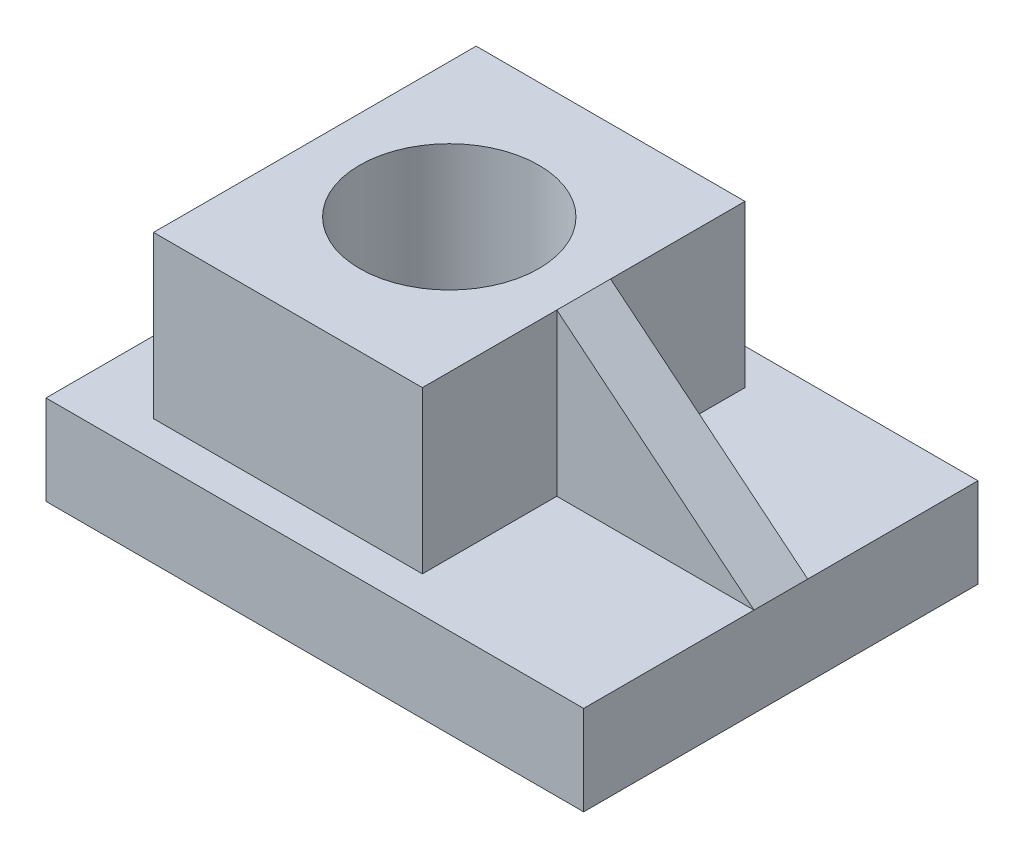
ISO-10303-21;
HEADER;
FILE_DESCRIPTION(('STEP AP214'),'2;1');
FILE_NAME('part.step','',(''),(''),'','','');
FILE_SCHEMA(('AUTOMOTIVE_DESIGN { 1 0 10303 214 1 1 1 1 }'));
ENDSEC;
DATA;
#1=APPLICATION_CONTEXT('core data for automotive mechanical design processes');
#2=APPLICATION_PROTOCOL_DEFINITION('international standard','automotive_design',2000,#1);
#3=PRODUCT_CONTEXT('',#1,'mechanical');
#4=PRODUCT('Part','Part','',(#3));
#5=PRODUCT_RELATED_PRODUCT_CATEGORY('part','',(#4));
#6=PRODUCT_DEFINITION_FORMATION('','',#4);
#7=PRODUCT_DEFINITION_CONTEXT('part definition',#1,'design');
#8=PRODUCT_DEFINITION('design','',#6,#7);
#9=PRODUCT_DEFINITION_SHAPE('','',#8);
#10=(LENGTH_UNIT() NAMED_UNIT(*) SI_UNIT(.MILLI.,.METRE.));
#11=(NAMED_UNIT(*) PLANE_ANGLE_UNIT() SI_UNIT($,.RADIAN.));
#12=(NAMED_UNIT(*) SI_UNIT($,.STERADIAN.) SOLID_ANGLE_UNIT());
#13=UNCERTAINTY_MEASURE_WITH_UNIT(LENGTH_MEASURE(1.E-05),#10,'distance_accuracy_value','');
#14=(GEOMETRIC_REPRESENTATION_CONTEXT(3) GLOBAL_UNCERTAINTY_ASSIGNED_CONTEXT((#13)) GLOBAL_UNIT_ASSIGNED_CONTEXT((#10,
#11,#12)) REPRESENTATION_CONTEXT('',''));
#15=CARTESIAN_POINT('',(0.,0.,0.));
#16=DIRECTION('',(0.,0.,1.));
#17=DIRECTION('',(1.,0.,0.));
#18=AXIS2_PLACEMENT_3D('',#15,#16,#17);
#19=CARTESIAN_POINT('',(8.00000000000014,28.,18.));
#20=DIRECTION('',(-1.,0.,0.));
#21=DIRECTION('',(0.,0.,1.));
#22=AXIS2_PLACEMENT_3D('',#19,#20,#21);
#23=PLANE('',#22);
#24=DIRECTION('',(0.,1.,0.));
#25=VECTOR('',#24,1.);
#26=CARTESIAN_POINT('',(8.00000000000014,28.,-3.));
#27=LINE('',#26,#25);
#28=CARTESIAN_POINT('',(8.00000000000014,10.,-3.));
#29=VERTEX_POINT('',#28);
#30=CARTESIAN_POINT('',(8.00000000000014,28.,-3.));
#31=VERTEX_POINT('',#30);
#32=EDGE_CURVE('E147',#29,#31,#27,.T.);
#33=ORIENTED_EDGE('',*,*,#32,.F.);
#34=DIRECTION('',(0.,0.,-1.));
#35=VECTOR('',#34,1.);
#36=CARTESIAN_POINT('',(8.00000000000014,10.,18.));
#37=LINE('',#36,#35);
#38=CARTESIAN_POINT('',(8.00000000000014,10.,-18.));
#39=VERTEX_POINT('',#38);
#40=EDGE_CURVE('E156',#29,#39,#37,.T.);
#41=ORIENTED_EDGE('',*,*,#40,.T.);
#42=DIRECTION('',(0.,-1.,0.));
#43=VECTOR('',#42,1.);
#44=CARTESIAN_POINT('',(8.00000000000014,28.,-18.));
#45=LINE('',#44,#43);
#46=CARTESIAN_POINT('',(8.00000000000014,28.,-18.));
#47=VERTEX_POINT('',#46);
#48=EDGE_CURVE('E172',#47,#39,#45,.T.);
#49=ORIENTED_EDGE('',*,*,#48,.F.);
#50=DIRECTION('',(0.,0.,-1.));
#51=VECTOR('',#50,1.);
#52=CARTESIAN_POINT('',(8.00000000000014,28.,18.));
#53=LINE('',#52,#51);
#54=EDGE_CURVE('E269',#31,#47,#53,.T.);
#55=ORIENTED_EDGE('',*,*,#54,.F.);
#56=EDGE_LOOP('',(#33,#41,#49,#55));
#57=FACE_BOUND('',#56,.T.);
#58=ADVANCED_FACE('F45',(#57),#23,.F.);
#59=CARTESIAN_POINT('',(0.,10.,0.));
#60=DIRECTION('',(0.,-1.,0.));
#61=DIRECTION('',(0.,0.,-1.));
#62=AXIS2_PLACEMENT_3D('',#59,#60,#61);
#63=PLANE('',#62);
#64=DIRECTION('',(0.,0.,-1.));
#65=VECTOR('',#64,1.);
#66=CARTESIAN_POINT('',(30.,10.,22.));
#67=LINE('',#66,#65);
#68=CARTESIAN_POINT('',(30.,10.,22.));
#69=VERTEX_POINT('',#68);
#70=CARTESIAN_POINT('',(30.,10.,3.));
#71=VERTEX_POINT('',#70);
#72=EDGE_CURVE('E162',#69,#71,#67,.T.);
#73=ORIENTED_EDGE('',*,*,#72,.T.);
#74=DIRECTION('',(-1.,0.,0.));
#75=VECTOR('',#74,1.);
#76=CARTESIAN_POINT('',(0.,10.,3.));
#77=LINE('',#76,#75);
#78=CARTESIAN_POINT('',(8.00000000000014,10.,3.));
#79=VERTEX_POINT('',#78);
#80=EDGE_CURVE('E140',#71,#79,#77,.T.);
#81=ORIENTED_EDGE('',*,*,#80,.T.);
#82=CARTESIAN_POINT('',(8.00000000000014,10.,18.));
#83=VERTEX_POINT('',#82);
#84=EDGE_CURVE('E69',#83,#79,#37,.T.);
#85=ORIENTED_EDGE('',*,*,#84,.F.);
#86=DIRECTION('',(1.,0.,0.));
#87=VECTOR('',#86,1.);
#88=CARTESIAN_POINT('',(-21.9999999999999,10.,18.));
#89=LINE('',#88,#87);
#90=CARTESIAN_POINT('',(-21.9999999999999,10.,18.));
#91=VERTEX_POINT('',#90);
#92=EDGE_CURVE('E266',#91,#83,#89,.T.);
#93=ORIENTED_EDGE('',*,*,#92,.F.);
#94=DIRECTION('',(0.,0.,1.));
#95=VECTOR('',#94,1.);
#96=CARTESIAN_POINT('',(-21.9999999999999,10.,18.));
#97=LINE('',#96,#95);
#98=CARTESIAN_POINT('',(-21.9999999999999,10.,-18.));
#99=VERTEX_POINT('',#98);
#100=EDGE_CURVE('E257',#99,#91,#97,.T.);
#101=ORIENTED_EDGE('',*,*,#100,.F.);
#102=DIRECTION('',(-1.,0.,0.));
#103=VECTOR('',#102,1.);
#104=CARTESIAN_POINT('',(-21.9999999999999,10.,-18.));
#105=LINE('',#104,#103);
#106=EDGE_CURVE('E252',#39,#99,#105,.T.);
#107=ORIENTED_EDGE('',*,*,#106,.F.);
#108=ORIENTED_EDGE('',*,*,#40,.F.);
#109=DIRECTION('',(-1.,0.,0.));
#110=VECTOR('',#109,1.);
#111=CARTESIAN_POINT('',(0.,10.,-3.));
#112=LINE('',#111,#110);
#113=CARTESIAN_POINT('',(30.,10.,-3.));
#114=VERTEX_POINT('',#113);
#115=EDGE_CURVE('E145',#114,#29,#112,.T.);
#116=ORIENTED_EDGE('',*,*,#115,.F.);
#117=CARTESIAN_POINT('',(30.,10.,-22.));
#118=VERTEX_POINT('',#117);
#119=EDGE_CURVE('E153',#114,#118,#67,.T.);
#120=ORIENTED_EDGE('',*,*,#119,.T.);
#121=DIRECTION('',(-1.,0.,0.));
#122=VECTOR('',#121,1.);
#123=CARTESIAN_POINT('',(-30.,10.,-22.));
#124=LINE('',#123,#122);
#125=CARTESIAN_POINT('',(-30.,10.,-22.));
#126=VERTEX_POINT('',#125);
#127=EDGE_CURVE('E167',#118,#126,#124,.T.);
#128=ORIENTED_EDGE('',*,*,#127,.T.);
#129=DIRECTION('',(0.,0.,1.));
#130=VECTOR('',#129,1.);
#131=CARTESIAN_POINT('',(-30.,10.,22.));
#132=LINE('',#131,#130);
#133=CARTESIAN_POINT('',(-30.,10.,22.));
#134=VERTEX_POINT('',#133);
#135=EDGE_CURVE('E176',#126,#134,#132,.T.);
#136=ORIENTED_EDGE('',*,*,#135,.T.);
#137=DIRECTION('',(1.,0.,0.));
#138=VECTOR('',#137,1.);
#139=CARTESIAN_POINT('',(-30.,10.,22.));
#140=LINE('',#139,#138);
#141=EDGE_CURVE('E179',#134,#69,#140,.T.);
#142=ORIENTED_EDGE('',*,*,#141,.T.);
#143=EDGE_LOOP('',(#73,#81,#85,#93,#101,#107,#108,#116,#120,#128,#136,#142));
#144=FACE_BOUND('',#143,.T.);
#145=ADVANCED_FACE('F152',(#144),#63,.F.);
#146=CARTESIAN_POINT('',(30.,10.,22.));
#147=DIRECTION('',(-1.,0.,0.));
#148=DIRECTION('',(0.,0.,1.));
#149=AXIS2_PLACEMENT_3D('',#146,#147,#148);
#150=PLANE('',#149);
#151=DIRECTION('',(0.,0.,-1.));
#152=VECTOR('',#151,1.);
#153=CARTESIAN_POINT('',(30.,0.,22.));
#154=LINE('',#153,#152);
#155=CARTESIAN_POINT('',(30.,0.,22.));
#156=VERTEX_POINT('',#155);
#157=CARTESIAN_POINT('',(30.,0.,-22.));
#158=VERTEX_POINT('',#157);
#159=EDGE_CURVE('E183',#156,#158,#154,.T.);
#160=ORIENTED_EDGE('',*,*,#159,.T.);
#161=DIRECTION('',(0.,-1.,0.));
#162=VECTOR('',#161,1.);
#163=CARTESIAN_POINT('',(30.,10.,-22.));
#164=LINE('',#163,#162);
#165=EDGE_CURVE('E11',#118,#158,#164,.T.);
#166=ORIENTED_EDGE('',*,*,#165,.F.);
#167=ORIENTED_EDGE('',*,*,#119,.F.);
#168=DIRECTION('',(0.,0.,1.));
#169=VECTOR('',#168,1.);
#170=CARTESIAN_POINT('',(30.,10.,22.));
#171=LINE('',#170,#169);
#172=EDGE_CURVE('E130',#71,#114,#171,.F.);
#173=ORIENTED_EDGE('',*,*,#172,.F.);
#174=ORIENTED_EDGE('',*,*,#72,.F.);
#175=DIRECTION('',(0.,-1.,0.));
#176=VECTOR('',#175,1.);
#177=CARTESIAN_POINT('',(30.,10.,22.));
#178=LINE('',#177,#176);
#179=EDGE_CURVE('E182',#69,#156,#178,.T.);
#180=ORIENTED_EDGE('',*,*,#179,.T.);
#181=EDGE_LOOP('',(#160,#166,#167,#173,#174,#180));
#182=FACE_BOUND('',#181,.T.);
#183=ADVANCED_FACE('F47',(#182),#150,.F.);
#184=CARTESIAN_POINT('',(-30.,10.,-22.));
#185=DIRECTION('',(0.,0.,1.));
#186=DIRECTION('',(1.,0.,0.));
#187=AXIS2_PLACEMENT_3D('',#184,#185,#186);
#188=PLANE('',#187);
#189=DIRECTION('',(-1.,0.,0.));
#190=VECTOR('',#189,1.);
#191=CARTESIAN_POINT('',(-30.,0.,-22.));
#192=LINE('',#191,#190);
#193=CARTESIAN_POINT('',(-30.,0.,-22.));
#194=VERTEX_POINT('',#193);
#195=EDGE_CURVE('E186',#158,#194,#192,.T.);
#196=ORIENTED_EDGE('',*,*,#195,.T.);
#197=DIRECTION('',(0.,-1.,0.));
#198=VECTOR('',#197,1.);
#199=CARTESIAN_POINT('',(-30.,10.,-22.));
#200=LINE('',#199,#198);
#201=EDGE_CURVE('E54',#126,#194,#200,.T.);
#202=ORIENTED_EDGE('',*,*,#201,.F.);
#203=ORIENTED_EDGE('',*,*,#127,.F.);
#204=ORIENTED_EDGE('',*,*,#165,.T.);
#205=EDGE_LOOP('',(#196,#202,#203,#204));
#206=FACE_BOUND('',#205,.T.);
#207=ADVANCED_FACE('F215',(#206),#188,.F.);
#208=CARTESIAN_POINT('',(-30.,10.,22.));
#209=DIRECTION('',(1.,0.,0.));
#210=DIRECTION('',(0.,0.,-1.));
#211=AXIS2_PLACEMENT_3D('',#208,#209,#210);
#212=PLANE('',#211);
#213=DIRECTION('',(0.,-1.,0.));
#214=VECTOR('',#213,1.);
#215=CARTESIAN_POINT('',(-30.,10.,22.));
#216=LINE('',#215,#214);
#217=CARTESIAN_POINT('',(-30.,0.,22.));
#218=VERTEX_POINT('',#217);
#219=EDGE_CURVE('E194',#134,#218,#216,.T.);
#220=ORIENTED_EDGE('',*,*,#219,.F.);
#221=ORIENTED_EDGE('',*,*,#135,.F.);
#222=ORIENTED_EDGE('',*,*,#201,.T.);
#223=DIRECTION('',(0.,0.,1.));
#224=VECTOR('',#223,1.);
#225=CARTESIAN_POINT('',(-30.,0.,22.));
#226=LINE('',#225,#224);
#227=EDGE_CURVE('E168',#194,#218,#226,.T.);
#228=ORIENTED_EDGE('',*,*,#227,.T.);
#229=EDGE_LOOP('',(#220,#221,#222,#228));
#230=FACE_BOUND('',#229,.T.);
#231=ADVANCED_FACE('F204',(#230),#212,.F.);
#232=CARTESIAN_POINT('',(-30.,10.,22.));
#233=DIRECTION('',(0.,0.,-1.));
#234=DIRECTION('',(-1.,0.,0.));
#235=AXIS2_PLACEMENT_3D('',#232,#233,#234);
#236=PLANE('',#235);
#237=DIRECTION('',(1.,0.,0.));
#238=VECTOR('',#237,1.);
#239=CARTESIAN_POINT('',(-30.,0.,22.));
#240=LINE('',#239,#238);
#241=EDGE_CURVE('E163',#218,#156,#240,.T.);
#242=ORIENTED_EDGE('',*,*,#241,.T.);
#243=ORIENTED_EDGE('',*,*,#179,.F.);
#244=ORIENTED_EDGE('',*,*,#141,.F.);
#245=ORIENTED_EDGE('',*,*,#219,.T.);
#246=EDGE_LOOP('',(#242,#243,#244,#245));
#247=FACE_BOUND('',#246,.T.);
#248=ADVANCED_FACE('F213',(#247),#236,.F.);
#249=CARTESIAN_POINT('',(0.,0.,0.));
#250=DIRECTION('',(0.,-1.,0.));
#251=DIRECTION('',(0.,0.,-1.));
#252=AXIS2_PLACEMENT_3D('',#249,#250,#251);
#253=PLANE('',#252);
#254=CARTESIAN_POINT('',(-6.99999999999986,0.,0.));
#255=DIRECTION('',(0.,1.,0.));
#256=DIRECTION('',(0.,0.,1.));
#257=AXIS2_PLACEMENT_3D('',#254,#255,#256);
#258=CIRCLE('',#257,10.);
#259=CARTESIAN_POINT('',(-6.99999999999986,0.,10.));
#260=VERTEX_POINT('',#259);
#261=EDGE_CURVE('E259',#260,#260,#258,.T.);
#262=ORIENTED_EDGE('',*,*,#261,.T.);
#263=EDGE_LOOP('',(#262));
#264=FACE_BOUND('',#263,.T.);
#265=ORIENTED_EDGE('',*,*,#195,.F.);
#266=ORIENTED_EDGE('',*,*,#159,.F.);
#267=ORIENTED_EDGE('',*,*,#241,.F.);
#268=ORIENTED_EDGE('',*,*,#227,.F.);
#269=EDGE_LOOP('',(#265,#266,#267,#268));
#270=FACE_BOUND('',#269,.T.);
#271=ADVANCED_FACE('F209',(#264,#270),#253,.T.);
#272=ORIENTED_EDGE('',*,*,#84,.T.);
#273=DIRECTION('',(0.,1.,0.));
#274=VECTOR('',#273,1.);
#275=CARTESIAN_POINT('',(8.00000000000014,28.,3.));
#276=LINE('',#275,#274);
#277=CARTESIAN_POINT('',(8.00000000000014,28.,3.));
#278=VERTEX_POINT('',#277);
#279=EDGE_CURVE('E158',#79,#278,#276,.T.);
#280=ORIENTED_EDGE('',*,*,#279,.T.);
#281=CARTESIAN_POINT('',(8.00000000000014,28.,18.));
#282=VERTEX_POINT('',#281);
#283=EDGE_CURVE('E296',#282,#278,#53,.T.);
#284=ORIENTED_EDGE('',*,*,#283,.F.);
#285=DIRECTION('',(0.,-1.,0.));
#286=VECTOR('',#285,1.);
#287=CARTESIAN_POINT('',(8.00000000000014,28.,18.));
#288=LINE('',#287,#286);
#289=EDGE_CURVE('E250',#282,#83,#288,.T.);
#290=ORIENTED_EDGE('',*,*,#289,.T.);
#291=EDGE_LOOP('',(#272,#280,#284,#290));
#292=FACE_BOUND('',#291,.T.);
#293=ADVANCED_FACE('F226',(#292),#23,.F.);
#294=CARTESIAN_POINT('',(-21.9999999999999,28.,-18.));
#295=DIRECTION('',(0.,0.,1.));
#296=DIRECTION('',(1.,0.,0.));
#297=AXIS2_PLACEMENT_3D('',#294,#295,#296);
#298=PLANE('',#297);
#299=ORIENTED_EDGE('',*,*,#106,.T.);
#300=DIRECTION('',(0.,-1.,0.));
#301=VECTOR('',#300,1.);
#302=CARTESIAN_POINT('',(-21.9999999999999,28.,-18.));
#303=LINE('',#302,#301);
#304=CARTESIAN_POINT('',(-21.9999999999999,28.,-18.));
#305=VERTEX_POINT('',#304);
#306=EDGE_CURVE('E275',#305,#99,#303,.T.);
#307=ORIENTED_EDGE('',*,*,#306,.F.);
#308=DIRECTION('',(-1.,0.,0.));
#309=VECTOR('',#308,1.);
#310=CARTESIAN_POINT('',(-21.9999999999999,28.,-18.));
#311=LINE('',#310,#309);
#312=EDGE_CURVE('E285',#47,#305,#311,.T.);
#313=ORIENTED_EDGE('',*,*,#312,.F.);
#314=ORIENTED_EDGE('',*,*,#48,.T.);
#315=EDGE_LOOP('',(#299,#307,#313,#314));
#316=FACE_BOUND('',#315,.T.);
#317=ADVANCED_FACE('F234',(#316),#298,.F.);
#318=CARTESIAN_POINT('',(-21.9999999999999,28.,18.));
#319=DIRECTION('',(1.,0.,0.));
#320=DIRECTION('',(0.,0.,-1.));
#321=AXIS2_PLACEMENT_3D('',#318,#319,#320);
#322=PLANE('',#321);
#323=DIRECTION('',(0.,-1.,0.));
#324=VECTOR('',#323,1.);
#325=CARTESIAN_POINT('',(-21.9999999999999,28.,18.));
#326=LINE('',#325,#324);
#327=CARTESIAN_POINT('',(-21.9999999999999,28.,18.));
#328=VERTEX_POINT('',#327);
#329=EDGE_CURVE('E272',#328,#91,#326,.T.);
#330=ORIENTED_EDGE('',*,*,#329,.F.);
#331=DIRECTION('',(0.,0.,1.));
#332=VECTOR('',#331,1.);
#333=CARTESIAN_POINT('',(-21.9999999999999,28.,18.));
#334=LINE('',#333,#332);
#335=EDGE_CURVE('E289',#305,#328,#334,.T.);
#336=ORIENTED_EDGE('',*,*,#335,.F.);
#337=ORIENTED_EDGE('',*,*,#306,.T.);
#338=ORIENTED_EDGE('',*,*,#100,.T.);
#339=EDGE_LOOP('',(#330,#336,#337,#338));
#340=FACE_BOUND('',#339,.T.);
#341=ADVANCED_FACE('F241',(#340),#322,.F.);
#342=CARTESIAN_POINT('',(-21.9999999999999,28.,18.));
#343=DIRECTION('',(0.,0.,-1.));
#344=DIRECTION('',(-1.,0.,0.));
#345=AXIS2_PLACEMENT_3D('',#342,#343,#344);
#346=PLANE('',#345);
#347=ORIENTED_EDGE('',*,*,#92,.T.);
#348=ORIENTED_EDGE('',*,*,#289,.F.);
#349=DIRECTION('',(1.,0.,0.));
#350=VECTOR('',#349,1.);
#351=CARTESIAN_POINT('',(-21.9999999999999,28.,18.));
#352=LINE('',#351,#350);
#353=EDGE_CURVE('E261',#328,#282,#352,.T.);
#354=ORIENTED_EDGE('',*,*,#353,.F.);
#355=ORIENTED_EDGE('',*,*,#329,.T.);
#356=EDGE_LOOP('',(#347,#348,#354,#355));
#357=FACE_BOUND('',#356,.T.);
#358=ADVANCED_FACE('F291',(#357),#346,.F.);
#359=CARTESIAN_POINT('',(0.,28.,0.));
#360=DIRECTION('',(0.,-1.,0.));
#361=DIRECTION('',(0.,0.,-1.));
#362=AXIS2_PLACEMENT_3D('',#359,#360,#361);
#363=PLANE('',#362);
#364=CARTESIAN_POINT('',(-6.99999999999986,28.,0.));
#365=DIRECTION('',(0.,1.,0.));
#366=DIRECTION('',(0.,0.,1.));
#367=AXIS2_PLACEMENT_3D('',#364,#365,#366);
#368=CIRCLE('',#367,10.);
#369=CARTESIAN_POINT('',(-6.99999999999986,28.,10.));
#370=VERTEX_POINT('',#369);
#371=EDGE_CURVE('E139',#370,#370,#368,.T.);
#372=ORIENTED_EDGE('',*,*,#371,.F.);
#373=EDGE_LOOP('',(#372));
#374=FACE_BOUND('',#373,.T.);
#375=ORIENTED_EDGE('',*,*,#283,.T.);
#376=EDGE_CURVE('E301',#278,#31,#53,.T.);
#377=ORIENTED_EDGE('',*,*,#376,.T.);
#378=ORIENTED_EDGE('',*,*,#54,.T.);
#379=ORIENTED_EDGE('',*,*,#312,.T.);
#380=ORIENTED_EDGE('',*,*,#335,.T.);
#381=ORIENTED_EDGE('',*,*,#353,.T.);
#382=EDGE_LOOP('',(#375,#377,#378,#379,#380,#381));
#383=FACE_BOUND('',#382,.T.);
#384=ADVANCED_FACE('F321',(#374,#383),#363,.F.);
#385=CARTESIAN_POINT('',(-6.99999999999986,0.,0.));
#386=DIRECTION('',(0.,1.,0.));
#387=DIRECTION('',(0.,0.,1.));
#388=AXIS2_PLACEMENT_3D('',#385,#386,#387);
#389=CYLINDRICAL_SURFACE('',#388,10.);
#390=CARTESIAN_POINT('',(-6.99999999999986,0.,10.));
#391=CARTESIAN_POINT('',(-6.99999999999986,0.291666666666667,10.));
#392=CARTESIAN_POINT('',(-6.99999999999986,0.583333333333333,10.));
#393=CARTESIAN_POINT('',(-6.99999999999986,1.16666666666667,10.));
#394=CARTESIAN_POINT('',(-6.99999999999986,1.45833333333333,10.));
#395=CARTESIAN_POINT('',(-6.99999999999986,2.04166666666667,10.));
#396=CARTESIAN_POINT('',(-6.99999999999986,2.33333333333333,10.));
#397=CARTESIAN_POINT('',(-6.99999999999986,2.91666666666667,10.));
#398=CARTESIAN_POINT('',(-6.99999999999986,3.20833333333333,10.));
#399=CARTESIAN_POINT('',(-6.99999999999986,3.79166666666667,10.));
#400=CARTESIAN_POINT('',(-6.99999999999986,4.08333333333333,10.));
#401=CARTESIAN_POINT('',(-6.99999999999986,4.66666666666667,10.));
#402=CARTESIAN_POINT('',(-6.99999999999986,4.95833333333333,10.));
#403=CARTESIAN_POINT('',(-6.99999999999986,5.54166666666667,10.));
#404=CARTESIAN_POINT('',(-6.99999999999986,5.83333333333333,10.));
#405=CARTESIAN_POINT('',(-6.99999999999986,6.41666666666667,10.));
#406=CARTESIAN_POINT('',(-6.99999999999986,6.70833333333333,10.));
#407=CARTESIAN_POINT('',(-6.99999999999986,7.29166666666667,10.));
#408=CARTESIAN_POINT('',(-6.99999999999986,7.58333333333333,10.));
#409=CARTESIAN_POINT('',(-6.99999999999986,8.16666666666666,10.));
#410=CARTESIAN_POINT('',(-6.99999999999986,8.45833333333333,10.));
#411=CARTESIAN_POINT('',(-6.99999999999986,9.04166666666666,10.));
#412=CARTESIAN_POINT('',(-6.99999999999986,9.33333333333333,10.));
#413=CARTESIAN_POINT('',(-6.99999999999986,9.91666666666666,10.));
#414=CARTESIAN_POINT('',(-6.99999999999986,10.2083333333333,10.));
#415=CARTESIAN_POINT('',(-6.99999999999986,10.7916666666667,10.));
#416=CARTESIAN_POINT('',(-6.99999999999986,11.0833333333333,10.));
#417=CARTESIAN_POINT('',(-6.99999999999986,11.6666666666667,10.));
#418=CARTESIAN_POINT('',(-6.99999999999986,11.9583333333333,10.));
#419=CARTESIAN_POINT('',(-6.99999999999986,12.5416666666667,10.));
#420=CARTESIAN_POINT('',(-6.99999999999986,12.8333333333333,10.));
#421=CARTESIAN_POINT('',(-6.99999999999986,13.4166666666667,10.));
#422=CARTESIAN_POINT('',(-6.99999999999986,13.7083333333333,10.));
#423=CARTESIAN_POINT('',(-6.99999999999986,14.2916666666667,10.));
#424=CARTESIAN_POINT('',(-6.99999999999986,14.5833333333333,10.));
#425=CARTESIAN_POINT('',(-6.99999999999986,15.1666666666667,10.));
#426=CARTESIAN_POINT('',(-6.99999999999986,15.4583333333333,10.));
#427=CARTESIAN_POINT('',(-6.99999999999986,16.0416666666667,10.));
#428=CARTESIAN_POINT('',(-6.99999999999986,16.3333333333333,10.));
#429=CARTESIAN_POINT('',(-6.99999999999986,16.9166666666667,10.));
#430=CARTESIAN_POINT('',(-6.99999999999986,17.2083333333333,10.));
#431=CARTESIAN_POINT('',(-6.99999999999986,17.7916666666667,10.));
#432=CARTESIAN_POINT('',(-6.99999999999986,18.0833333333333,10.));
#433=CARTESIAN_POINT('',(-6.99999999999986,18.6666666666667,10.));
#434=CARTESIAN_POINT('',(-6.99999999999986,18.9583333333333,10.));
#435=CARTESIAN_POINT('',(-6.99999999999986,19.5416666666667,10.));
#436=CARTESIAN_POINT('',(-6.99999999999986,19.8333333333333,10.));
#437=CARTESIAN_POINT('',(-6.99999999999986,20.4166666666667,10.));
#438=CARTESIAN_POINT('',(-6.99999999999986,20.7083333333333,10.));
#439=CARTESIAN_POINT('',(-6.99999999999986,21.2916666666667,10.));
#440=CARTESIAN_POINT('',(-6.99999999999986,21.5833333333333,10.));
#441=CARTESIAN_POINT('',(-6.99999999999986,22.1666666666667,10.));
#442=CARTESIAN_POINT('',(-6.99999999999986,22.4583333333333,10.));
#443=CARTESIAN_POINT('',(-6.99999999999986,23.0416666666667,10.));
#444=CARTESIAN_POINT('',(-6.99999999999986,23.3333333333333,10.));
#445=CARTESIAN_POINT('',(-6.99999999999986,23.9166666666667,10.));
#446=CARTESIAN_POINT('',(-6.99999999999986,24.2083333333333,10.));
#447=CARTESIAN_POINT('',(-6.99999999999986,24.7916666666667,10.));
#448=CARTESIAN_POINT('',(-6.99999999999986,25.0833333333333,10.));
#449=CARTESIAN_POINT('',(-6.99999999999986,25.6666666666667,10.));
#450=CARTESIAN_POINT('',(-6.99999999999986,25.9583333333333,10.));
#451=CARTESIAN_POINT('',(-6.99999999999986,26.5416666666667,10.));
#452=CARTESIAN_POINT('',(-6.99999999999986,26.8333333333333,10.));
#453=CARTESIAN_POINT('',(-6.99999999999986,27.4166666666667,10.));
#454=CARTESIAN_POINT('',(-6.99999999999986,27.7083333333333,10.));
#455=CARTESIAN_POINT('',(-6.99999999999986,28.,10.));
#456=B_SPLINE_CURVE_WITH_KNOTS('',3,(#390,#391,#392,#393,#394,#395,#396,#397,#398,#399,#400,
#401,#402,#403,#404,#405,#406,#407,#408,#409,#410,#411,#412,#413,#414,#415,#416,#417,#418,#419,
#420,#421,#422,#423,#424,#425,#426,#427,#428,#429,#430,#431,#432,#433,#434,#435,#436,#437,#438,
#439,#440,#441,#442,#443,#444,#445,#446,#447,#448,#449,#450,#451,#452,#453,#454,#455),
.UNSPECIFIED.,.F.,.F.,(4,2,2,2,2,2,2,2,2,2,2,2,2,2,2,2,2,2,2,2,2,2,2,2,2,2,2,2,2,2,2,2,4),(0.,
0.875,1.75,2.625,3.5,4.375,5.25,6.125,7.,7.875,8.75,9.625,10.5,11.375,12.25,13.125,14.,14.875,
15.75,16.625,17.5,18.375,19.25,20.125,21.,21.875,22.75,23.625,24.5,25.375,26.25,27.125,28.),.UNSPECIFIED.);
#457=EDGE_CURVE('BSEAM317',#260,#370,#456,.T.);
#458=ORIENTED_EDGE('',*,*,#261,.F.);
#459=ORIENTED_EDGE('',*,*,#371,.T.);
#460=ORIENTED_EDGE('',*,*,#457,.T.);
#461=ORIENTED_EDGE('',*,*,#457,.F.);
#462=EDGE_LOOP('',(#458,#460,#459,#461));
#463=FACE_BOUND('',#462,.T.);
#464=ADVANCED_FACE('F317',(#463),#389,.F.);
#465=CARTESIAN_POINT('',(0.,14.,3.));
#466=DIRECTION('',(0.,0.,1.));
#467=DIRECTION('',(1.,0.,0.));
#468=AXIS2_PLACEMENT_3D('',#465,#466,#467);
#469=PLANE('',#468);
#470=ORIENTED_EDGE('',*,*,#80,.F.);
#471=DIRECTION('',(0.773957299203319,-0.633237790257265,0.));
#472=VECTOR('',#471,1.);
#473=CARTESIAN_POINT('',(8.00000000000014,28.,3.));
#474=LINE('',#473,#472);
#475=EDGE_CURVE('E133',#278,#71,#474,.T.);
#476=ORIENTED_EDGE('',*,*,#475,.F.);
#477=ORIENTED_EDGE('',*,*,#279,.F.);
#478=EDGE_LOOP('',(#470,#476,#477));
#479=FACE_BOUND('',#478,.T.);
#480=ADVANCED_FACE('F320',(#479),#469,.T.);
#481=CARTESIAN_POINT('',(0.,14.,-3.));
#482=DIRECTION('',(0.,0.,1.));
#483=DIRECTION('',(1.,0.,0.));
#484=AXIS2_PLACEMENT_3D('',#481,#482,#483);
#485=PLANE('',#484);
#486=DIRECTION('',(0.773957299203319,-0.633237790257265,0.));
#487=VECTOR('',#486,1.);
#488=CARTESIAN_POINT('',(8.00000000000014,28.,-3.));
#489=LINE('',#488,#487);
#490=EDGE_CURVE('E61',#31,#114,#489,.T.);
#491=ORIENTED_EDGE('',*,*,#490,.T.);
#492=ORIENTED_EDGE('',*,*,#115,.T.);
#493=ORIENTED_EDGE('',*,*,#32,.T.);
#494=EDGE_LOOP('',(#491,#492,#493));
#495=FACE_BOUND('',#494,.T.);
#496=ADVANCED_FACE('F144',(#495),#485,.F.);
#497=CARTESIAN_POINT('',(8.00000000000014,28.,0.));
#498=DIRECTION('',(-0.633237790257265,-0.773957299203319,0.));
#499=DIRECTION('',(0.773957299203319,-0.633237790257265,0.));
#500=AXIS2_PLACEMENT_3D('',#497,#498,#499);
#501=PLANE('',#500);
#502=ORIENTED_EDGE('',*,*,#475,.T.);
#503=ORIENTED_EDGE('',*,*,#172,.T.);
#504=ORIENTED_EDGE('',*,*,#490,.F.);
#505=ORIENTED_EDGE('',*,*,#376,.F.);
#506=EDGE_LOOP('',(#502,#503,#504,#505));
#507=FACE_BOUND('',#506,.T.);
#508=ADVANCED_FACE('F131',(#507),#501,.F.);
#509=CLOSED_SHELL('',(#58,#145,#183,#207,#231,#248,#271,#293,#317,#341,#358,#384,#464,#480,#496,#508));
#510=MANIFOLD_SOLID_BREP('B2',#509);
#511=ADVANCED_BREP_SHAPE_REPRESENTATION('',(#18,#510),#14);
#512=SHAPE_DEFINITION_REPRESENTATION(#9,#511);
ENDSEC;
END-ISO-10303-21;
